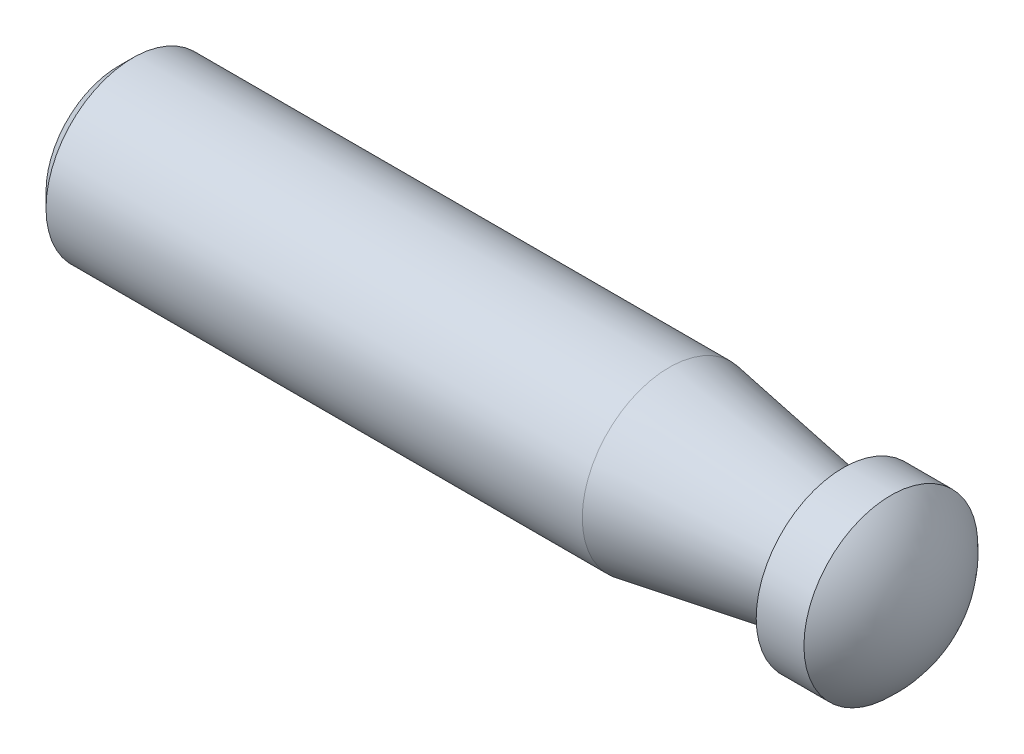
ISO-10303-21;
HEADER;
FILE_DESCRIPTION(('STEP AP214'),'2;1');
FILE_NAME('part.step','',(''),(''),'','','');
FILE_SCHEMA(('AUTOMOTIVE_DESIGN { 1 0 10303 214 1 1 1 1 }'));
ENDSEC;
DATA;
#1=APPLICATION_CONTEXT('core data for automotive mechanical design processes');
#2=APPLICATION_PROTOCOL_DEFINITION('international standard','automotive_design',2000,#1);
#3=PRODUCT_CONTEXT('',#1,'mechanical');
#4=PRODUCT('Part','Part','',(#3));
#5=PRODUCT_RELATED_PRODUCT_CATEGORY('part','',(#4));
#6=PRODUCT_DEFINITION_FORMATION('','',#4);
#7=PRODUCT_DEFINITION_CONTEXT('part definition',#1,'design');
#8=PRODUCT_DEFINITION('design','',#6,#7);
#9=PRODUCT_DEFINITION_SHAPE('','',#8);
#10=(LENGTH_UNIT() NAMED_UNIT(*) SI_UNIT(.MILLI.,.METRE.));
#11=(NAMED_UNIT(*) PLANE_ANGLE_UNIT() SI_UNIT($,.RADIAN.));
#12=(NAMED_UNIT(*) SI_UNIT($,.STERADIAN.) SOLID_ANGLE_UNIT());
#13=UNCERTAINTY_MEASURE_WITH_UNIT(LENGTH_MEASURE(1.E-05),#10,'distance_accuracy_value','');
#14=(GEOMETRIC_REPRESENTATION_CONTEXT(3) GLOBAL_UNCERTAINTY_ASSIGNED_CONTEXT((#13)) GLOBAL_UNIT_ASSIGNED_CONTEXT((#10,
#11,#12)) REPRESENTATION_CONTEXT('',''));
#15=CARTESIAN_POINT('',(0.,0.,0.));
#16=DIRECTION('',(0.,0.,1.));
#17=DIRECTION('',(1.,0.,0.));
#18=AXIS2_PLACEMENT_3D('',#15,#16,#17);
#19=CARTESIAN_POINT('',(24.,0.,0.));
#20=DIRECTION('',(0.,0.,1.));
#21=DIRECTION('',(1.,0.,0.));
#22=AXIS2_PLACEMENT_3D('',#19,#20,#21);
#23=SPHERICAL_SURFACE('',#22,4.);
#24=CARTESIAN_POINT('',(24.,0.,0.));
#25=DIRECTION('',(-1.,0.,0.));
#26=DIRECTION('',(0.,0.,1.));
#27=AXIS2_PLACEMENT_3D('',#24,#25,#26);
#28=SPHERICAL_SURFACE('',#27,4.);
#29=CARTESIAN_POINT('',(26.6457513110646,0.,0.));
#30=DIRECTION('',(-1.,0.,0.));
#31=DIRECTION('',(0.,0.,1.));
#32=AXIS2_PLACEMENT_3D('',#29,#30,#31);
#33=CIRCLE('',#32,3.);
#34=CARTESIAN_POINT('',(26.6457513110646,0.,3.));
#35=VERTEX_POINT('',#34);
#36=EDGE_CURVE('E40',#35,#35,#33,.T.);
#37=ORIENTED_EDGE('',*,*,#36,.F.);
#38=EDGE_LOOP('',(#37));
#39=FACE_BOUND('',#38,.T.);
#40=ADVANCED_FACE('F29',(#39),#28,.T.);
#41=CARTESIAN_POINT('',(0.,0.,0.));
#42=DIRECTION('',(-1.,0.,0.));
#43=DIRECTION('',(0.,0.,1.));
#44=AXIS2_PLACEMENT_3D('',#41,#42,#43);
#45=CYLINDRICAL_SURFACE('',#44,3.);
#46=ORIENTED_EDGE('',*,*,#36,.T.);
#47=EDGE_LOOP('',(#46));
#48=FACE_BOUND('',#47,.T.);
#49=CARTESIAN_POINT('',(25.,0.,0.));
#50=DIRECTION('',(-1.,0.,0.));
#51=DIRECTION('',(0.,0.,1.));
#52=AXIS2_PLACEMENT_3D('',#49,#50,#51);
#53=CIRCLE('',#52,3.);
#54=CARTESIAN_POINT('',(25.,0.,3.));
#55=VERTEX_POINT('',#54);
#56=EDGE_CURVE('E48',#55,#55,#53,.T.);
#57=ORIENTED_EDGE('',*,*,#56,.F.);
#58=EDGE_LOOP('',(#57));
#59=FACE_BOUND('',#58,.T.);
#60=ADVANCED_FACE('F73',(#48,#59),#45,.T.);
#61=CARTESIAN_POINT('',(25.,3.,0.));
#62=DIRECTION('',(1.,0.,0.));
#63=DIRECTION('',(0.,0.,-1.));
#64=AXIS2_PLACEMENT_3D('',#61,#62,#63);
#65=PLANE('',#64);
#66=CARTESIAN_POINT('',(25.,0.,0.));
#67=DIRECTION('',(-1.,0.,0.));
#68=DIRECTION('',(0.,0.,1.));
#69=AXIS2_PLACEMENT_3D('',#66,#67,#68);
#70=CIRCLE('',#69,2.);
#71=CARTESIAN_POINT('',(25.,0.,2.));
#72=VERTEX_POINT('',#71);
#73=EDGE_CURVE('E53',#72,#72,#70,.T.);
#74=ORIENTED_EDGE('',*,*,#73,.F.);
#75=EDGE_LOOP('',(#74));
#76=FACE_BOUND('',#75,.T.);
#77=ORIENTED_EDGE('',*,*,#56,.T.);
#78=EDGE_LOOP('',(#77));
#79=FACE_BOUND('',#78,.T.);
#80=ADVANCED_FACE('F64',(#76,#79),#65,.F.);
#81=CARTESIAN_POINT('',(19.,0.,0.));
#82=DIRECTION('',(-1.,0.,0.));
#83=DIRECTION('',(0.,0.,1.));
#84=AXIS2_PLACEMENT_3D('',#81,#82,#83);
#85=CONICAL_SURFACE('',#84,3.,0.165148677414627);
#86=ORIENTED_EDGE('',*,*,#73,.T.);
#87=EDGE_LOOP('',(#86));
#88=FACE_BOUND('',#87,.T.);
#89=CARTESIAN_POINT('',(19.,0.,0.));
#90=DIRECTION('',(-1.,0.,0.));
#91=DIRECTION('',(0.,0.,1.));
#92=AXIS2_PLACEMENT_3D('',#89,#90,#91);
#93=CIRCLE('',#92,3.);
#94=CARTESIAN_POINT('',(19.,0.,3.));
#95=VERTEX_POINT('',#94);
#96=EDGE_CURVE('E56',#95,#95,#93,.T.);
#97=ORIENTED_EDGE('',*,*,#96,.F.);
#98=EDGE_LOOP('',(#97));
#99=FACE_BOUND('',#98,.T.);
#100=ADVANCED_FACE('F62',(#88,#99),#85,.T.);
#101=CARTESIAN_POINT('',(0.,0.,0.));
#102=DIRECTION('',(-1.,0.,0.));
#103=DIRECTION('',(0.,0.,1.));
#104=AXIS2_PLACEMENT_3D('',#101,#102,#103);
#105=CYLINDRICAL_SURFACE('',#104,3.);
#106=CARTESIAN_POINT('',(0.500000000000004,0.,0.));
#107=DIRECTION('',(-1.,0.,0.));
#108=DIRECTION('',(0.,0.,1.));
#109=AXIS2_PLACEMENT_3D('',#106,#107,#108);
#110=CIRCLE('',#109,3.);
#111=CARTESIAN_POINT('',(0.500000000000004,0.,3.));
#112=VERTEX_POINT('',#111);
#113=EDGE_CURVE('E10',#112,#112,#110,.F.);
#114=ORIENTED_EDGE('',*,*,#113,.T.);
#115=EDGE_LOOP('',(#114));
#116=FACE_BOUND('',#115,.T.);
#117=ORIENTED_EDGE('',*,*,#96,.T.);
#118=EDGE_LOOP('',(#117));
#119=FACE_BOUND('',#118,.T.);
#120=ADVANCED_FACE('F60',(#116,#119),#105,.T.);
#121=CARTESIAN_POINT('',(0.,0.,0.));
#122=DIRECTION('',(-1.,0.,0.));
#123=DIRECTION('',(0.,0.,1.));
#124=AXIS2_PLACEMENT_3D('',#121,#122,#123);
#125=PLANE('',#124);
#126=CARTESIAN_POINT('',(0.,0.,0.));
#127=DIRECTION('',(-1.,0.,0.));
#128=DIRECTION('',(0.,0.,1.));
#129=AXIS2_PLACEMENT_3D('',#126,#127,#128);
#130=CIRCLE('',#129,2.49999999999999);
#131=CARTESIAN_POINT('',(0.,0.,2.49999999999999));
#132=VERTEX_POINT('',#131);
#133=EDGE_CURVE('E35',#132,#132,#130,.T.);
#134=ORIENTED_EDGE('',*,*,#133,.T.);
#135=EDGE_LOOP('',(#134));
#136=FACE_BOUND('',#135,.T.);
#137=ADVANCED_FACE('F71',(#136),#125,.T.);
#138=CARTESIAN_POINT('',(0.,0.,0.));
#139=DIRECTION('',(1.,0.,0.));
#140=DIRECTION('',(0.,0.,-1.));
#141=AXIS2_PLACEMENT_3D('',#138,#139,#140);
#142=CONICAL_SURFACE('',#141,2.49999999999999,0.785398163397453);
#143=ORIENTED_EDGE('',*,*,#113,.F.);
#144=EDGE_LOOP('',(#143));
#145=FACE_BOUND('',#144,.T.);
#146=ORIENTED_EDGE('',*,*,#133,.F.);
#147=EDGE_LOOP('',(#146));
#148=FACE_BOUND('',#147,.T.);
#149=ADVANCED_FACE('F111',(#145,#148),#142,.T.);
#150=CLOSED_SHELL('',(#40,#60,#80,#100,#120,#137,#149));
#151=MANIFOLD_SOLID_BREP('B2',#150);
#152=ADVANCED_BREP_SHAPE_REPRESENTATION('',(#18,#151),#14);
#153=SHAPE_DEFINITION_REPRESENTATION(#9,#152);
ENDSEC;
END-ISO-10303-21;
